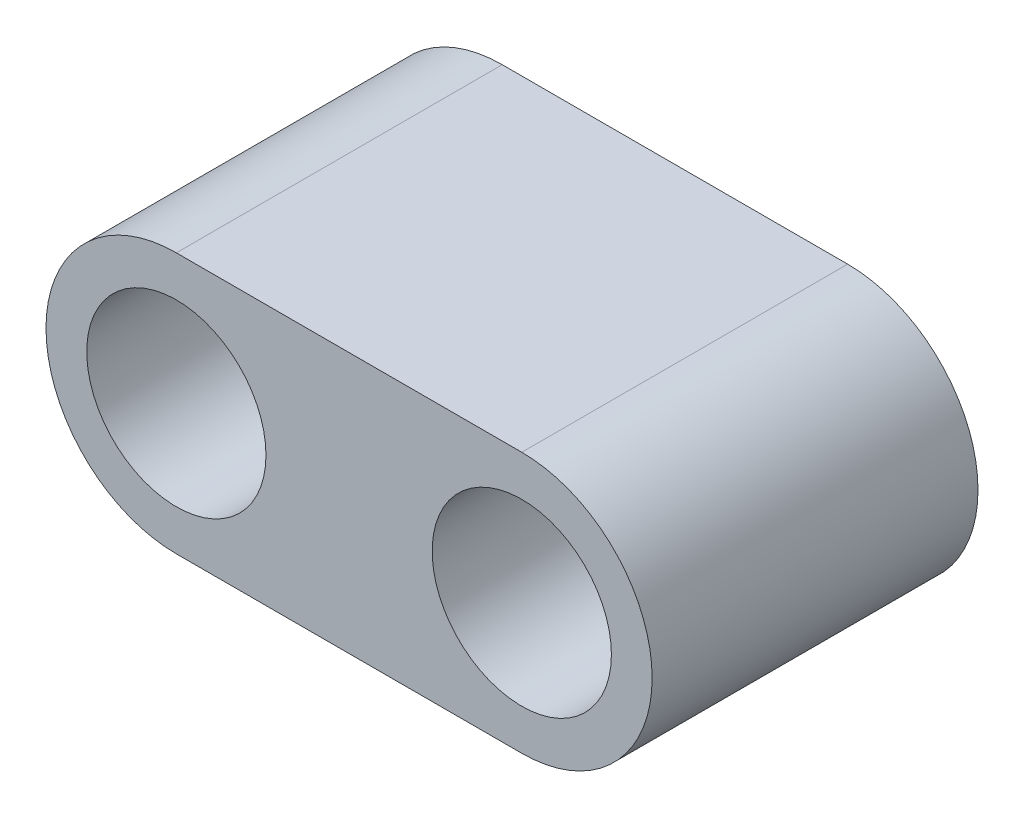
ISO-10303-21;
HEADER;
FILE_DESCRIPTION(('STEP AP214'),'2;1');
FILE_NAME('part.step','',(''),(''),'','','');
FILE_SCHEMA(('AUTOMOTIVE_DESIGN { 1 0 10303 214 1 1 1 1 }'));
ENDSEC;
DATA;
#1=APPLICATION_CONTEXT('core data for automotive mechanical design processes');
#2=APPLICATION_PROTOCOL_DEFINITION('international standard','automotive_design',2000,#1);
#3=PRODUCT_CONTEXT('',#1,'mechanical');
#4=PRODUCT('Part','Part','',(#3));
#5=PRODUCT_RELATED_PRODUCT_CATEGORY('part','',(#4));
#6=PRODUCT_DEFINITION_FORMATION('','',#4);
#7=PRODUCT_DEFINITION_CONTEXT('part definition',#1,'design');
#8=PRODUCT_DEFINITION('design','',#6,#7);
#9=PRODUCT_DEFINITION_SHAPE('','',#8);
#10=(LENGTH_UNIT() NAMED_UNIT(*) SI_UNIT(.MILLI.,.METRE.));
#11=(NAMED_UNIT(*) PLANE_ANGLE_UNIT() SI_UNIT($,.RADIAN.));
#12=(NAMED_UNIT(*) SI_UNIT($,.STERADIAN.) SOLID_ANGLE_UNIT());
#13=UNCERTAINTY_MEASURE_WITH_UNIT(LENGTH_MEASURE(1.E-05),#10,'distance_accuracy_value','');
#14=(GEOMETRIC_REPRESENTATION_CONTEXT(3) GLOBAL_UNCERTAINTY_ASSIGNED_CONTEXT((#13)) GLOBAL_UNIT_ASSIGNED_CONTEXT((#10,
#11,#12)) REPRESENTATION_CONTEXT('',''));
#15=CARTESIAN_POINT('',(0.,0.,0.));
#16=DIRECTION('',(0.,0.,1.));
#17=DIRECTION('',(1.,0.,0.));
#18=AXIS2_PLACEMENT_3D('',#15,#16,#17);
#19=CARTESIAN_POINT('',(0.,-40.,100.));
#20=DIRECTION('',(0.,0.,-1.));
#21=DIRECTION('',(-1.,0.,0.));
#22=AXIS2_PLACEMENT_3D('',#19,#20,#21);
#23=CYLINDRICAL_SURFACE('',#22,40.);
#24=CARTESIAN_POINT('',(0.,-40.,0.));
#25=DIRECTION('',(0.,0.,1.));
#26=DIRECTION('',(1.,0.,0.));
#27=AXIS2_PLACEMENT_3D('',#24,#25,#26);
#28=CIRCLE('',#27,40.);
#29=CARTESIAN_POINT('',(0.,0.,0.));
#30=VERTEX_POINT('',#29);
#31=CARTESIAN_POINT('',(0.,-80.,0.));
#32=VERTEX_POINT('',#31);
#33=EDGE_CURVE('E96',#30,#32,#28,.T.);
#34=ORIENTED_EDGE('',*,*,#33,.T.);
#35=DIRECTION('',(0.,0.,-1.));
#36=VECTOR('',#35,1.);
#37=CARTESIAN_POINT('',(0.,-80.,100.));
#38=LINE('',#37,#36);
#39=CARTESIAN_POINT('',(0.,-80.,100.));
#40=VERTEX_POINT('',#39);
#41=EDGE_CURVE('E11',#40,#32,#38,.T.);
#42=ORIENTED_EDGE('',*,*,#41,.F.);
#43=CARTESIAN_POINT('',(0.,-40.,100.));
#44=DIRECTION('',(0.,0.,1.));
#45=DIRECTION('',(1.,0.,0.));
#46=AXIS2_PLACEMENT_3D('',#43,#44,#45);
#47=CIRCLE('',#46,40.);
#48=CARTESIAN_POINT('',(0.,0.,100.));
#49=VERTEX_POINT('',#48);
#50=EDGE_CURVE('E84',#49,#40,#47,.T.);
#51=ORIENTED_EDGE('',*,*,#50,.F.);
#52=DIRECTION('',(0.,0.,-1.));
#53=VECTOR('',#52,1.);
#54=CARTESIAN_POINT('',(0.,0.,100.));
#55=LINE('',#54,#53);
#56=EDGE_CURVE('E92',#49,#30,#55,.T.);
#57=ORIENTED_EDGE('',*,*,#56,.T.);
#58=EDGE_LOOP('',(#34,#42,#51,#57));
#59=FACE_BOUND('',#58,.T.);
#60=ADVANCED_FACE('F33',(#59),#23,.T.);
#61=CARTESIAN_POINT('',(0.,-80.,100.));
#62=DIRECTION('',(0.,1.,0.));
#63=DIRECTION('',(0.,0.,1.));
#64=AXIS2_PLACEMENT_3D('',#61,#62,#63);
#65=PLANE('',#64);
#66=DIRECTION('',(1.,0.,0.));
#67=VECTOR('',#66,1.);
#68=CARTESIAN_POINT('',(0.,-80.,0.));
#69=LINE('',#68,#67);
#70=CARTESIAN_POINT('',(106.,-80.,0.));
#71=VERTEX_POINT('',#70);
#72=EDGE_CURVE('E88',#32,#71,#69,.T.);
#73=ORIENTED_EDGE('',*,*,#72,.T.);
#74=DIRECTION('',(0.,0.,-1.));
#75=VECTOR('',#74,1.);
#76=CARTESIAN_POINT('',(106.,-80.,100.));
#77=LINE('',#76,#75);
#78=CARTESIAN_POINT('',(106.,-80.,100.));
#79=VERTEX_POINT('',#78);
#80=EDGE_CURVE('E41',#79,#71,#77,.T.);
#81=ORIENTED_EDGE('',*,*,#80,.F.);
#82=DIRECTION('',(1.,0.,0.));
#83=VECTOR('',#82,1.);
#84=CARTESIAN_POINT('',(0.,-80.,100.));
#85=LINE('',#84,#83);
#86=EDGE_CURVE('E79',#40,#79,#85,.T.);
#87=ORIENTED_EDGE('',*,*,#86,.F.);
#88=ORIENTED_EDGE('',*,*,#41,.T.);
#89=EDGE_LOOP('',(#73,#81,#87,#88));
#90=FACE_BOUND('',#89,.T.);
#91=ADVANCED_FACE('F87',(#90),#65,.F.);
#92=CARTESIAN_POINT('',(106.,-40.,100.));
#93=DIRECTION('',(0.,0.,-1.));
#94=DIRECTION('',(-1.,0.,0.));
#95=AXIS2_PLACEMENT_3D('',#92,#93,#94);
#96=CYLINDRICAL_SURFACE('',#95,40.);
#97=CARTESIAN_POINT('',(106.,-40.,0.));
#98=DIRECTION('',(0.,0.,1.));
#99=DIRECTION('',(-1.,0.,0.));
#100=AXIS2_PLACEMENT_3D('',#97,#98,#99);
#101=CIRCLE('',#100,40.);
#102=CARTESIAN_POINT('',(106.,0.,0.));
#103=VERTEX_POINT('',#102);
#104=EDGE_CURVE('E66',#71,#103,#101,.T.);
#105=ORIENTED_EDGE('',*,*,#104,.T.);
#106=DIRECTION('',(0.,0.,-1.));
#107=VECTOR('',#106,1.);
#108=CARTESIAN_POINT('',(106.,0.,100.));
#109=LINE('',#108,#107);
#110=CARTESIAN_POINT('',(106.,0.,100.));
#111=VERTEX_POINT('',#110);
#112=EDGE_CURVE('E89',#111,#103,#109,.T.);
#113=ORIENTED_EDGE('',*,*,#112,.F.);
#114=CARTESIAN_POINT('',(106.,-40.,100.));
#115=DIRECTION('',(0.,0.,1.));
#116=DIRECTION('',(-1.,0.,0.));
#117=AXIS2_PLACEMENT_3D('',#114,#115,#116);
#118=CIRCLE('',#117,40.);
#119=EDGE_CURVE('E82',#79,#111,#118,.T.);
#120=ORIENTED_EDGE('',*,*,#119,.F.);
#121=ORIENTED_EDGE('',*,*,#80,.T.);
#122=EDGE_LOOP('',(#105,#113,#120,#121));
#123=FACE_BOUND('',#122,.T.);
#124=ADVANCED_FACE('F90',(#123),#96,.T.);
#125=CARTESIAN_POINT('',(0.,0.,100.));
#126=DIRECTION('',(0.,-1.,0.));
#127=DIRECTION('',(0.,0.,-1.));
#128=AXIS2_PLACEMENT_3D('',#125,#126,#127);
#129=PLANE('',#128);
#130=DIRECTION('',(-1.,0.,0.));
#131=VECTOR('',#130,1.);
#132=CARTESIAN_POINT('',(0.,0.,0.));
#133=LINE('',#132,#131);
#134=EDGE_CURVE('E72',#103,#30,#133,.T.);
#135=ORIENTED_EDGE('',*,*,#134,.T.);
#136=ORIENTED_EDGE('',*,*,#56,.F.);
#137=DIRECTION('',(-1.,0.,0.));
#138=VECTOR('',#137,1.);
#139=CARTESIAN_POINT('',(0.,0.,100.));
#140=LINE('',#139,#138);
#141=EDGE_CURVE('E49',#111,#49,#140,.T.);
#142=ORIENTED_EDGE('',*,*,#141,.F.);
#143=ORIENTED_EDGE('',*,*,#112,.T.);
#144=EDGE_LOOP('',(#135,#136,#142,#143));
#145=FACE_BOUND('',#144,.T.);
#146=ADVANCED_FACE('F104',(#145),#129,.F.);
#147=CARTESIAN_POINT('',(0.,-40.,100.));
#148=DIRECTION('',(0.,0.,1.));
#149=DIRECTION('',(1.,0.,0.));
#150=AXIS2_PLACEMENT_3D('',#147,#148,#149);
#151=PLANE('',#150);
#152=CARTESIAN_POINT('',(0.,-40.,100.));
#153=DIRECTION('',(0.,0.,1.));
#154=DIRECTION('',(1.,0.,0.));
#155=AXIS2_PLACEMENT_3D('',#152,#153,#154);
#156=CIRCLE('',#155,27.5);
#157=CARTESIAN_POINT('',(27.5,-40.,100.));
#158=VERTEX_POINT('',#157);
#159=EDGE_CURVE('E116',#158,#158,#156,.T.);
#160=ORIENTED_EDGE('',*,*,#159,.F.);
#161=EDGE_LOOP('',(#160));
#162=FACE_BOUND('',#161,.T.);
#163=CARTESIAN_POINT('',(106.,-40.,100.));
#164=DIRECTION('',(0.,0.,1.));
#165=DIRECTION('',(1.,0.,0.));
#166=AXIS2_PLACEMENT_3D('',#163,#164,#165);
#167=CIRCLE('',#166,27.5);
#168=CARTESIAN_POINT('',(133.5,-40.,100.));
#169=VERTEX_POINT('',#168);
#170=EDGE_CURVE('E110',#169,#169,#167,.T.);
#171=ORIENTED_EDGE('',*,*,#170,.F.);
#172=EDGE_LOOP('',(#171));
#173=FACE_BOUND('',#172,.T.);
#174=ORIENTED_EDGE('',*,*,#50,.T.);
#175=ORIENTED_EDGE('',*,*,#86,.T.);
#176=ORIENTED_EDGE('',*,*,#119,.T.);
#177=ORIENTED_EDGE('',*,*,#141,.T.);
#178=EDGE_LOOP('',(#174,#175,#176,#177));
#179=FACE_BOUND('',#178,.T.);
#180=ADVANCED_FACE('F80',(#162,#173,#179),#151,.T.);
#181=CARTESIAN_POINT('',(0.,-40.,0.));
#182=DIRECTION('',(0.,0.,1.));
#183=DIRECTION('',(1.,0.,0.));
#184=AXIS2_PLACEMENT_3D('',#181,#182,#183);
#185=PLANE('',#184);
#186=CARTESIAN_POINT('',(0.,-40.,0.));
#187=DIRECTION('',(0.,0.,1.));
#188=DIRECTION('',(1.,0.,0.));
#189=AXIS2_PLACEMENT_3D('',#186,#187,#188);
#190=CIRCLE('',#189,27.5);
#191=CARTESIAN_POINT('',(27.5,-40.,0.));
#192=VERTEX_POINT('',#191);
#193=EDGE_CURVE('E99',#192,#192,#190,.T.);
#194=ORIENTED_EDGE('',*,*,#193,.T.);
#195=EDGE_LOOP('',(#194));
#196=FACE_BOUND('',#195,.T.);
#197=CARTESIAN_POINT('',(106.,-40.,0.));
#198=DIRECTION('',(0.,0.,1.));
#199=DIRECTION('',(1.,0.,0.));
#200=AXIS2_PLACEMENT_3D('',#197,#198,#199);
#201=CIRCLE('',#200,27.5);
#202=CARTESIAN_POINT('',(133.5,-40.,0.));
#203=VERTEX_POINT('',#202);
#204=EDGE_CURVE('E113',#203,#203,#201,.T.);
#205=ORIENTED_EDGE('',*,*,#204,.T.);
#206=EDGE_LOOP('',(#205));
#207=FACE_BOUND('',#206,.T.);
#208=ORIENTED_EDGE('',*,*,#33,.F.);
#209=ORIENTED_EDGE('',*,*,#134,.F.);
#210=ORIENTED_EDGE('',*,*,#104,.F.);
#211=ORIENTED_EDGE('',*,*,#72,.F.);
#212=EDGE_LOOP('',(#208,#209,#210,#211));
#213=FACE_BOUND('',#212,.T.);
#214=ADVANCED_FACE('F107',(#196,#207,#213),#185,.F.);
#215=CARTESIAN_POINT('',(106.,-40.,0.));
#216=DIRECTION('',(0.,0.,1.));
#217=DIRECTION('',(1.,0.,0.));
#218=AXIS2_PLACEMENT_3D('',#215,#216,#217);
#219=CYLINDRICAL_SURFACE('',#218,27.5);
#220=ORIENTED_EDGE('',*,*,#204,.F.);
#221=EDGE_LOOP('',(#220));
#222=FACE_BOUND('',#221,.T.);
#223=ORIENTED_EDGE('',*,*,#170,.T.);
#224=EDGE_LOOP('',(#223));
#225=FACE_BOUND('',#224,.T.);
#226=ADVANCED_FACE('F127',(#222,#225),#219,.F.);
#227=CARTESIAN_POINT('',(0.,-40.,0.));
#228=DIRECTION('',(0.,0.,1.));
#229=DIRECTION('',(1.,0.,0.));
#230=AXIS2_PLACEMENT_3D('',#227,#228,#229);
#231=CYLINDRICAL_SURFACE('',#230,27.5);
#232=ORIENTED_EDGE('',*,*,#193,.F.);
#233=EDGE_LOOP('',(#232));
#234=FACE_BOUND('',#233,.T.);
#235=ORIENTED_EDGE('',*,*,#159,.T.);
#236=EDGE_LOOP('',(#235));
#237=FACE_BOUND('',#236,.T.);
#238=ADVANCED_FACE('F124',(#234,#237),#231,.F.);
#239=CLOSED_SHELL('',(#60,#91,#124,#146,#180,#214,#226,#238));
#240=MANIFOLD_SOLID_BREP('B2',#239);
#241=ADVANCED_BREP_SHAPE_REPRESENTATION('',(#18,#240),#14);
#242=SHAPE_DEFINITION_REPRESENTATION(#9,#241);
ENDSEC;
END-ISO-10303-21;
